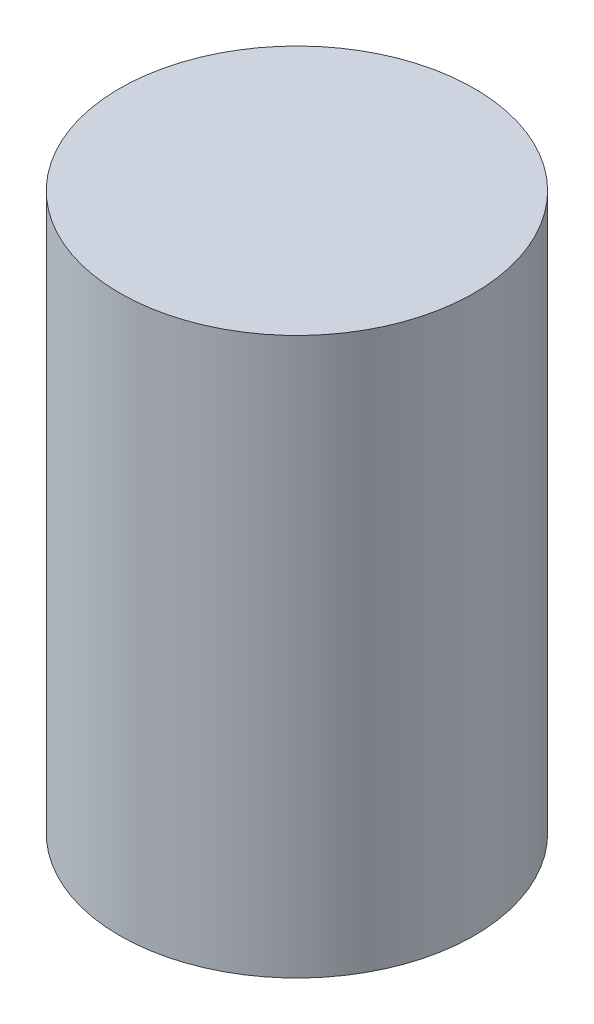
ISO-10303-21;
HEADER;
FILE_DESCRIPTION(('STEP AP214'),'2;1');
FILE_NAME('part.step','',(''),(''),'','','');
FILE_SCHEMA(('AUTOMOTIVE_DESIGN { 1 0 10303 214 1 1 1 1 }'));
ENDSEC;
DATA;
#1=APPLICATION_CONTEXT('core data for automotive mechanical design processes');
#2=APPLICATION_PROTOCOL_DEFINITION('international standard','automotive_design',2000,#1);
#3=PRODUCT_CONTEXT('',#1,'mechanical');
#4=PRODUCT('Part','Part','',(#3));
#5=PRODUCT_RELATED_PRODUCT_CATEGORY('part','',(#4));
#6=PRODUCT_DEFINITION_FORMATION('','',#4);
#7=PRODUCT_DEFINITION_CONTEXT('part definition',#1,'design');
#8=PRODUCT_DEFINITION('design','',#6,#7);
#9=PRODUCT_DEFINITION_SHAPE('','',#8);
#10=(LENGTH_UNIT() NAMED_UNIT(*) SI_UNIT(.MILLI.,.METRE.));
#11=(NAMED_UNIT(*) PLANE_ANGLE_UNIT() SI_UNIT($,.RADIAN.));
#12=(NAMED_UNIT(*) SI_UNIT($,.STERADIAN.) SOLID_ANGLE_UNIT());
#13=UNCERTAINTY_MEASURE_WITH_UNIT(LENGTH_MEASURE(1.E-05),#10,'distance_accuracy_value','');
#14=(GEOMETRIC_REPRESENTATION_CONTEXT(3) GLOBAL_UNCERTAINTY_ASSIGNED_CONTEXT((#13)) GLOBAL_UNIT_ASSIGNED_CONTEXT((#10,
#11,#12)) REPRESENTATION_CONTEXT('',''));
#15=CARTESIAN_POINT('',(0.,0.,0.));
#16=DIRECTION('',(0.,0.,1.));
#17=DIRECTION('',(1.,0.,0.));
#18=AXIS2_PLACEMENT_3D('',#15,#16,#17);
#19=CARTESIAN_POINT('',(0.,43.5797630428711,0.));
#20=DIRECTION('',(0.,-1.,0.));
#21=DIRECTION('',(0.,0.,-1.));
#22=AXIS2_PLACEMENT_3D('',#19,#20,#21);
#23=CYLINDRICAL_SURFACE('',#22,13.8827819182633);
#24=CARTESIAN_POINT('',(0.,43.5797630428711,0.));
#25=DIRECTION('',(0.,1.,0.));
#26=DIRECTION('',(0.,0.,1.));
#27=AXIS2_PLACEMENT_3D('',#24,#25,#26);
#28=CIRCLE('',#27,13.8827819182633);
#29=CARTESIAN_POINT('',(0.,43.5797630428711,13.8827819182633));
#30=VERTEX_POINT('',#29);
#31=EDGE_CURVE('E10',#30,#30,#28,.T.);
#32=ORIENTED_EDGE('',*,*,#31,.F.);
#33=EDGE_LOOP('',(#32));
#34=FACE_BOUND('',#33,.T.);
#35=CARTESIAN_POINT('',(0.,0.,0.));
#36=DIRECTION('',(0.,1.,0.));
#37=DIRECTION('',(0.,0.,1.));
#38=AXIS2_PLACEMENT_3D('',#35,#36,#37);
#39=CIRCLE('',#38,13.8827819182633);
#40=CARTESIAN_POINT('',(0.,0.,13.8827819182633));
#41=VERTEX_POINT('',#40);
#42=EDGE_CURVE('E38',#41,#41,#39,.T.);
#43=ORIENTED_EDGE('',*,*,#42,.T.);
#44=EDGE_LOOP('',(#43));
#45=FACE_BOUND('',#44,.T.);
#46=ADVANCED_FACE('F35',(#34,#45),#23,.T.);
#47=CARTESIAN_POINT('',(0.,43.5797630428711,0.));
#48=DIRECTION('',(0.,1.,0.));
#49=DIRECTION('',(0.,0.,1.));
#50=AXIS2_PLACEMENT_3D('',#47,#48,#49);
#51=PLANE('',#50);
#52=ORIENTED_EDGE('',*,*,#31,.T.);
#53=EDGE_LOOP('',(#52));
#54=FACE_BOUND('',#53,.T.);
#55=ADVANCED_FACE('F50',(#54),#51,.T.);
#56=CARTESIAN_POINT('',(0.,0.,0.));
#57=DIRECTION('',(0.,1.,0.));
#58=DIRECTION('',(0.,0.,1.));
#59=AXIS2_PLACEMENT_3D('',#56,#57,#58);
#60=PLANE('',#59);
#61=ORIENTED_EDGE('',*,*,#42,.F.);
#62=EDGE_LOOP('',(#61));
#63=FACE_BOUND('',#62,.T.);
#64=ADVANCED_FACE('F48',(#63),#60,.F.);
#65=CLOSED_SHELL('',(#46,#55,#64));
#66=MANIFOLD_SOLID_BREP('B2',#65);
#67=ADVANCED_BREP_SHAPE_REPRESENTATION('',(#18,#66),#14);
#68=SHAPE_DEFINITION_REPRESENTATION(#9,#67);
ENDSEC;
END-ISO-10303-21;
